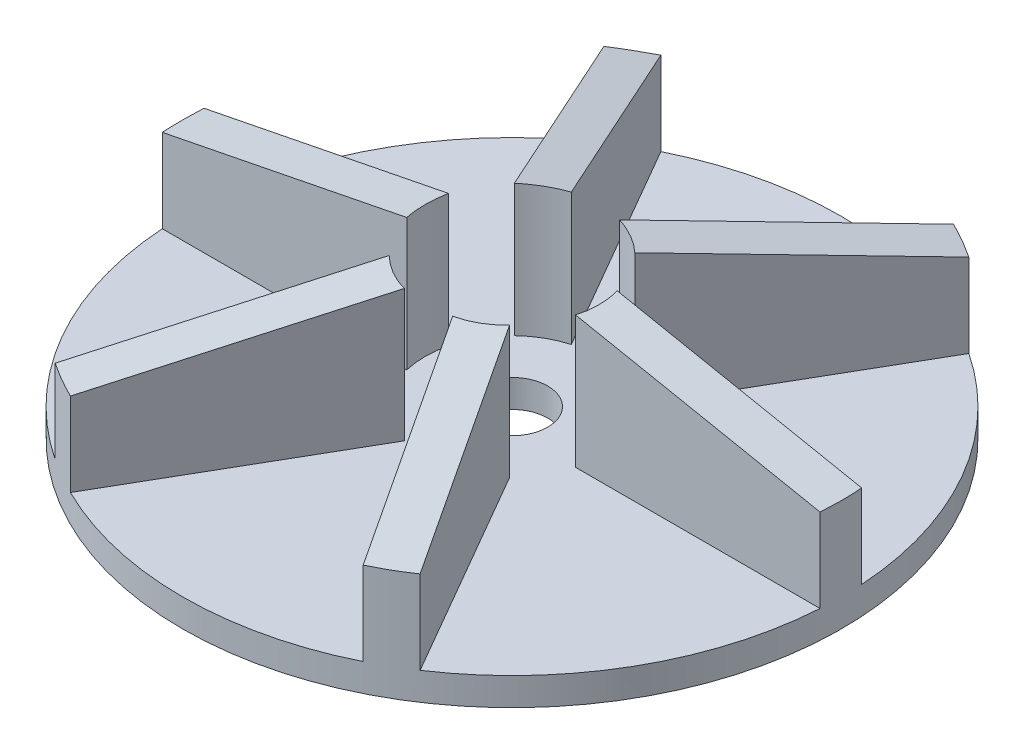
ISO-10303-21;
HEADER;
FILE_DESCRIPTION(('STEP AP214'),'2;1');
FILE_NAME('part.step','',(''),(''),'','','');
FILE_SCHEMA(('AUTOMOTIVE_DESIGN { 1 0 10303 214 1 1 1 1 }'));
ENDSEC;
DATA;
#1=APPLICATION_CONTEXT('core data for automotive mechanical design processes');
#2=APPLICATION_PROTOCOL_DEFINITION('international standard','automotive_design',2000,#1);
#3=PRODUCT_CONTEXT('',#1,'mechanical');
#4=PRODUCT('Part','Part','',(#3));
#5=PRODUCT_RELATED_PRODUCT_CATEGORY('part','',(#4));
#6=PRODUCT_DEFINITION_FORMATION('','',#4);
#7=PRODUCT_DEFINITION_CONTEXT('part definition',#1,'design');
#8=PRODUCT_DEFINITION('design','',#6,#7);
#9=PRODUCT_DEFINITION_SHAPE('','',#8);
#10=(LENGTH_UNIT() NAMED_UNIT(*) SI_UNIT(.MILLI.,.METRE.));
#11=(NAMED_UNIT(*) PLANE_ANGLE_UNIT() SI_UNIT($,.RADIAN.));
#12=(NAMED_UNIT(*) SI_UNIT($,.STERADIAN.) SOLID_ANGLE_UNIT());
#13=UNCERTAINTY_MEASURE_WITH_UNIT(LENGTH_MEASURE(1.E-05),#10,'distance_accuracy_value','');
#14=(GEOMETRIC_REPRESENTATION_CONTEXT(3) GLOBAL_UNCERTAINTY_ASSIGNED_CONTEXT((#13)) GLOBAL_UNIT_ASSIGNED_CONTEXT((#10,
#11,#12)) REPRESENTATION_CONTEXT('',''));
#15=CARTESIAN_POINT('',(0.,0.,0.));
#16=DIRECTION('',(0.,0.,1.));
#17=DIRECTION('',(1.,0.,0.));
#18=AXIS2_PLACEMENT_3D('',#15,#16,#17);
#19=CARTESIAN_POINT('',(0.,12.33424,0.));
#20=DIRECTION('',(0.,-1.,0.));
#21=DIRECTION('',(0.,0.,-1.));
#22=AXIS2_PLACEMENT_3D('',#19,#20,#21);
#23=CYLINDRICAL_SURFACE('',#22,7.9375);
#24=DIRECTION('',(0.,-1.,0.));
#25=VECTOR('',#24,1.);
#26=CARTESIAN_POINT('',(-2.20297650488551,12.33424,7.62566723434235));
#27=LINE('',#26,#25);
#28=CARTESIAN_POINT('',(-2.20297650488551,0.,7.62566723434235));
#29=VERTEX_POINT('',#28);
#30=CARTESIAN_POINT('',(-2.20297650488551,12.0653114927375,7.62566723434235));
#31=VERTEX_POINT('',#30);
#32=EDGE_CURVE('E309',#29,#31,#27,.F.);
#33=ORIENTED_EDGE('',*,*,#32,.F.);
#34=CARTESIAN_POINT('',(0.,0.,0.));
#35=DIRECTION('',(0.,1.,0.));
#36=DIRECTION('',(0.,0.,1.));
#37=AXIS2_PLACEMENT_3D('',#34,#35,#36);
#38=CIRCLE('',#37,7.9375);
#39=CARTESIAN_POINT('',(-5.50253329330423,0.,5.72066723434238));
#40=VERTEX_POINT('',#39);
#41=EDGE_CURVE('E12',#29,#40,#38,.F.);
#42=ORIENTED_EDGE('',*,*,#41,.T.);
#43=DIRECTION('',(0.,-1.,0.));
#44=VECTOR('',#43,1.);
#45=CARTESIAN_POINT('',(-5.50253329330423,12.33424,5.72066723434238));
#46=LINE('',#45,#44);
#47=CARTESIAN_POINT('',(-5.50253329330424,12.0653114927375,5.72066723434239));
#48=VERTEX_POINT('',#47);
#49=EDGE_CURVE('E316',#40,#48,#46,.F.);
#50=ORIENTED_EDGE('',*,*,#49,.T.);
#51=CARTESIAN_POINT('',(0.,13.5940582789952,0.));
#52=DIRECTION('',(-0.0973018132737315,0.980881964629065,0.168531684258686));
#53=DIRECTION('',(-0.490440982314525,-0.194603626547466,0.849468699482764));
#54=AXIS2_PLACEMENT_3D('',#51,#52,#53);
#55=ELLIPSE('',#54,8.09220710159727,7.9375);
#56=EDGE_CURVE('E313',#48,#31,#55,.T.);
#57=ORIENTED_EDGE('',*,*,#56,.T.);
#58=EDGE_LOOP('',(#33,#42,#50,#57));
#59=FACE_BOUND('',#58,.T.);
#60=ADVANCED_FACE('F46',(#59),#23,.F.);
#61=DIRECTION('',(0.,-1.,0.));
#62=VECTOR('',#61,1.);
#63=CARTESIAN_POINT('',(-7.70550979818986,12.33424,1.905));
#64=LINE('',#63,#62);
#65=CARTESIAN_POINT('',(-7.70550979818986,0.,1.905));
#66=VERTEX_POINT('',#65);
#67=CARTESIAN_POINT('',(-7.70550979818987,12.0653114927375,1.905));
#68=VERTEX_POINT('',#67);
#69=EDGE_CURVE('E325',#66,#68,#64,.F.);
#70=ORIENTED_EDGE('',*,*,#69,.F.);
#71=CARTESIAN_POINT('',(-7.70550979818986,0.,-1.905));
#72=VERTEX_POINT('',#71);
#73=EDGE_CURVE('E55',#66,#72,#38,.F.);
#74=ORIENTED_EDGE('',*,*,#73,.T.);
#75=DIRECTION('',(0.,-1.,0.));
#76=VECTOR('',#75,1.);
#77=CARTESIAN_POINT('',(-7.70550979818986,12.33424,-1.905));
#78=LINE('',#77,#76);
#79=CARTESIAN_POINT('',(-7.70550979818989,12.0653114927375,-1.905));
#80=VERTEX_POINT('',#79);
#81=EDGE_CURVE('E336',#72,#80,#78,.F.);
#82=ORIENTED_EDGE('',*,*,#81,.T.);
#83=CARTESIAN_POINT('',(0.,13.5940582789952,0.));
#84=DIRECTION('',(-0.194603626547466,0.980881964629065,0.));
#85=DIRECTION('',(-0.980881964629065,-0.194603626547466,0.));
#86=AXIS2_PLACEMENT_3D('',#83,#84,#85);
#87=ELLIPSE('',#86,8.09220710159727,7.9375);
#88=EDGE_CURVE('E329',#80,#68,#87,.T.);
#89=ORIENTED_EDGE('',*,*,#88,.T.);
#90=EDGE_LOOP('',(#70,#74,#82,#89));
#91=FACE_BOUND('',#90,.T.);
#92=ADVANCED_FACE('F492',(#91),#23,.F.);
#93=DIRECTION('',(0.,-1.,0.));
#94=VECTOR('',#93,1.);
#95=CARTESIAN_POINT('',(-5.50253329330432,12.33424,-5.7206672343423));
#96=LINE('',#95,#94);
#97=CARTESIAN_POINT('',(-5.50253329330432,0.,-5.7206672343423));
#98=VERTEX_POINT('',#97);
#99=CARTESIAN_POINT('',(-5.50253329330432,12.0653114927375,-5.7206672343423));
#100=VERTEX_POINT('',#99);
#101=EDGE_CURVE('E345',#98,#100,#96,.F.);
#102=ORIENTED_EDGE('',*,*,#101,.F.);
#103=CARTESIAN_POINT('',(-2.20297650488561,0.,-7.62566723434232));
#104=VERTEX_POINT('',#103);
#105=EDGE_CURVE('E477',#98,#104,#38,.F.);
#106=ORIENTED_EDGE('',*,*,#105,.T.);
#107=DIRECTION('',(0.,-1.,0.));
#108=VECTOR('',#107,1.);
#109=CARTESIAN_POINT('',(-2.20297650488561,12.33424,-7.62566723434232));
#110=LINE('',#109,#108);
#111=CARTESIAN_POINT('',(-2.20297650488561,12.0653114927375,-7.62566723434232));
#112=VERTEX_POINT('',#111);
#113=EDGE_CURVE('E222',#104,#112,#110,.F.);
#114=ORIENTED_EDGE('',*,*,#113,.T.);
#115=CARTESIAN_POINT('',(0.,13.5940582789952,0.));
#116=DIRECTION('',(-0.0973018132737338,0.980881964629065,-0.168531684258685));
#117=DIRECTION('',(-0.490440982314536,-0.194603626547466,-0.849468699482757));
#118=AXIS2_PLACEMENT_3D('',#115,#116,#117);
#119=ELLIPSE('',#118,8.09220710159727,7.9375);
#120=EDGE_CURVE('E349',#112,#100,#119,.T.);
#121=ORIENTED_EDGE('',*,*,#120,.T.);
#122=EDGE_LOOP('',(#102,#106,#114,#121));
#123=FACE_BOUND('',#122,.T.);
#124=ADVANCED_FACE('F602',(#123),#23,.F.);
#125=DIRECTION('',(0.,-1.,0.));
#126=VECTOR('',#125,1.);
#127=CARTESIAN_POINT('',(2.20297650488556,12.33424,-7.62566723434233));
#128=LINE('',#127,#126);
#129=CARTESIAN_POINT('',(2.20297650488556,0.,-7.62566723434233));
#130=VERTEX_POINT('',#129);
#131=CARTESIAN_POINT('',(2.20297650488556,12.0653114927375,-7.62566723434233));
#132=VERTEX_POINT('',#131);
#133=EDGE_CURVE('E352',#130,#132,#128,.F.);
#134=ORIENTED_EDGE('',*,*,#133,.F.);
#135=CARTESIAN_POINT('',(5.50253329330427,0.,-5.72066723434234));
#136=VERTEX_POINT('',#135);
#137=EDGE_CURVE('E474',#130,#136,#38,.F.);
#138=ORIENTED_EDGE('',*,*,#137,.T.);
#139=DIRECTION('',(0.,-1.,0.));
#140=VECTOR('',#139,1.);
#141=CARTESIAN_POINT('',(5.50253329330427,12.33424,-5.72066723434234));
#142=LINE('',#141,#140);
#143=CARTESIAN_POINT('',(5.50253329330427,12.0653114927375,-5.72066723434234));
#144=VERTEX_POINT('',#143);
#145=EDGE_CURVE('E339',#136,#144,#142,.F.);
#146=ORIENTED_EDGE('',*,*,#145,.T.);
#147=CARTESIAN_POINT('',(0.,13.5940582789952,0.));
#148=DIRECTION('',(0.0973018132737327,0.980881964629065,-0.168531684258686));
#149=DIRECTION('',(0.490440982314531,-0.194603626547466,-0.849468699482761));
#150=AXIS2_PLACEMENT_3D('',#147,#148,#149);
#151=ELLIPSE('',#150,8.09220710159727,7.9375);
#152=EDGE_CURVE('E342',#144,#132,#151,.T.);
#153=ORIENTED_EDGE('',*,*,#152,.T.);
#154=EDGE_LOOP('',(#134,#138,#146,#153));
#155=FACE_BOUND('',#154,.T.);
#156=ADVANCED_FACE('F618',(#155),#23,.F.);
#157=DIRECTION('',(0.,-1.,0.));
#158=VECTOR('',#157,1.);
#159=CARTESIAN_POINT('',(7.70550979818986,12.33424,-1.905));
#160=LINE('',#159,#158);
#161=CARTESIAN_POINT('',(7.70550979818986,0.,-1.905));
#162=VERTEX_POINT('',#161);
#163=CARTESIAN_POINT('',(7.70550979818989,12.0653114927375,-1.905));
#164=VERTEX_POINT('',#163);
#165=EDGE_CURVE('E332',#162,#164,#160,.F.);
#166=ORIENTED_EDGE('',*,*,#165,.F.);
#167=CARTESIAN_POINT('',(7.70550979818986,0.,1.905));
#168=VERTEX_POINT('',#167);
#169=EDGE_CURVE('E56',#162,#168,#38,.F.);
#170=ORIENTED_EDGE('',*,*,#169,.T.);
#171=DIRECTION('',(0.,-1.,0.));
#172=VECTOR('',#171,1.);
#173=CARTESIAN_POINT('',(7.70550979818986,12.33424,1.905));
#174=LINE('',#173,#172);
#175=CARTESIAN_POINT('',(7.70550979818987,12.0653114927375,1.905));
#176=VERTEX_POINT('',#175);
#177=EDGE_CURVE('E319',#168,#176,#174,.F.);
#178=ORIENTED_EDGE('',*,*,#177,.T.);
#179=CARTESIAN_POINT('',(0.,13.5940582789952,0.));
#180=DIRECTION('',(0.194603626547466,0.980881964629065,0.));
#181=DIRECTION('',(0.980881964629065,-0.194603626547466,0.));
#182=AXIS2_PLACEMENT_3D('',#179,#180,#181);
#183=ELLIPSE('',#182,8.09220710159727,7.9375);
#184=EDGE_CURVE('E322',#176,#164,#183,.T.);
#185=ORIENTED_EDGE('',*,*,#184,.T.);
#186=EDGE_LOOP('',(#166,#170,#178,#185));
#187=FACE_BOUND('',#186,.T.);
#188=ADVANCED_FACE('F608',(#187),#23,.F.);
#189=CARTESIAN_POINT('',(30.1117,7.62,-1.905));
#190=DIRECTION('',(0.194603626547466,0.980881964629065,0.));
#191=DIRECTION('',(-0.980881964629065,0.194603626547466,0.));
#192=AXIS2_PLACEMENT_3D('',#189,#190,#191);
#193=PLANE('',#192);
#194=ORIENTED_EDGE('',*,*,#184,.F.);
#195=DIRECTION('',(-0.980881964629065,0.194603626547466,0.));
#196=VECTOR('',#195,1.);
#197=CARTESIAN_POINT('',(30.1117,7.62,1.905));
#198=LINE('',#197,#196);
#199=CARTESIAN_POINT('',(30.0513801994185,7.63196724210362,1.905));
#200=VERTEX_POINT('',#199);
#201=EDGE_CURVE('E434',#200,#176,#198,.T.);
#202=ORIENTED_EDGE('',*,*,#201,.F.);
#203=CARTESIAN_POINT('',(0.,13.5940582789952,0.));
#204=DIRECTION('',(0.194603626547466,0.980881964629065,0.));
#205=DIRECTION('',(0.980881964629065,-0.194603626547466,0.));
#206=AXIS2_PLACEMENT_3D('',#203,#204,#205);
#207=ELLIPSE('',#206,30.6985968606194,30.1117);
#208=CARTESIAN_POINT('',(30.0513801994185,7.63196724210361,-1.905));
#209=VERTEX_POINT('',#208);
#210=EDGE_CURVE('E63',#200,#209,#207,.T.);
#211=ORIENTED_EDGE('',*,*,#210,.T.);
#212=DIRECTION('',(-0.980881964629065,0.194603626547466,0.));
#213=VECTOR('',#212,1.);
#214=CARTESIAN_POINT('',(30.1117,7.62,-1.905));
#215=LINE('',#214,#213);
#216=EDGE_CURVE('E442',#209,#164,#215,.T.);
#217=ORIENTED_EDGE('',*,*,#216,.T.);
#218=EDGE_LOOP('',(#194,#202,#211,#217));
#219=FACE_BOUND('',#218,.T.);
#220=ADVANCED_FACE('F617',(#219),#193,.T.);
#221=CARTESIAN_POINT('',(0.,0.,-1.905));
#222=DIRECTION('',(0.,0.,1.));
#223=DIRECTION('',(1.,0.,0.));
#224=AXIS2_PLACEMENT_3D('',#221,#222,#223);
#225=PLANE('',#224);
#226=DIRECTION('',(1.,0.,0.));
#227=VECTOR('',#226,1.);
#228=CARTESIAN_POINT('',(6.35,0.,-1.905));
#229=LINE('',#228,#227);
#230=CARTESIAN_POINT('',(30.0513801994185,0.,-1.905));
#231=VERTEX_POINT('',#230);
#232=EDGE_CURVE('E438',#162,#231,#229,.T.);
#233=ORIENTED_EDGE('',*,*,#232,.F.);
#234=ORIENTED_EDGE('',*,*,#165,.T.);
#235=ORIENTED_EDGE('',*,*,#216,.F.);
#236=DIRECTION('',(0.,-1.,0.));
#237=VECTOR('',#236,1.);
#238=CARTESIAN_POINT('',(30.0513801994185,12.33424,-1.905));
#239=LINE('',#238,#237);
#240=EDGE_CURVE('E301',#231,#209,#239,.F.);
#241=ORIENTED_EDGE('',*,*,#240,.F.);
#242=EDGE_LOOP('',(#233,#234,#235,#241));
#243=FACE_BOUND('',#242,.T.);
#244=ADVANCED_FACE('F623',(#243),#225,.F.);
#245=CARTESIAN_POINT('',(0.,0.,1.905));
#246=DIRECTION('',(0.,0.,1.));
#247=DIRECTION('',(1.,0.,0.));
#248=AXIS2_PLACEMENT_3D('',#245,#246,#247);
#249=PLANE('',#248);
#250=ORIENTED_EDGE('',*,*,#177,.F.);
#251=DIRECTION('',(1.,0.,0.));
#252=VECTOR('',#251,1.);
#253=CARTESIAN_POINT('',(6.35,0.,1.905));
#254=LINE('',#253,#252);
#255=CARTESIAN_POINT('',(30.0513801994185,0.,1.905));
#256=VERTEX_POINT('',#255);
#257=EDGE_CURVE('E430',#168,#256,#254,.T.);
#258=ORIENTED_EDGE('',*,*,#257,.T.);
#259=DIRECTION('',(0.,-1.,0.));
#260=VECTOR('',#259,1.);
#261=CARTESIAN_POINT('',(30.0513801994185,12.33424,1.905));
#262=LINE('',#261,#260);
#263=EDGE_CURVE('E296',#256,#200,#262,.F.);
#264=ORIENTED_EDGE('',*,*,#263,.T.);
#265=ORIENTED_EDGE('',*,*,#201,.T.);
#266=EDGE_LOOP('',(#250,#258,#264,#265));
#267=FACE_BOUND('',#266,.T.);
#268=ADVANCED_FACE('F467',(#267),#249,.T.);
#269=CARTESIAN_POINT('',(13.4060716057906,7.62,-27.0299971511359));
#270=DIRECTION('',(0.0973018132737327,0.980881964629065,-0.168531684258686));
#271=DIRECTION('',(0.,0.169335193182353,0.985558517973385));
#272=AXIS2_PLACEMENT_3D('',#269,#270,#271);
#273=PLANE('',#272);
#274=ORIENTED_EDGE('',*,*,#152,.F.);
#275=DIRECTION('',(-0.490440982314531,0.194603626547466,0.849468699482761));
#276=VECTOR('',#275,1.);
#277=CARTESIAN_POINT('',(16.7056283942093,7.62,-25.1249971511359));
#278=LINE('',#277,#276);
#279=CARTESIAN_POINT('',(16.6754684939185,7.63196724210362,-25.0727586714811));
#280=VERTEX_POINT('',#279);
#281=EDGE_CURVE('E418',#280,#144,#278,.T.);
#282=ORIENTED_EDGE('',*,*,#281,.F.);
#283=CARTESIAN_POINT('',(0.,13.5940582789952,0.));
#284=DIRECTION('',(0.0973018132737327,0.980881964629065,-0.168531684258686));
#285=DIRECTION('',(0.490440982314531,-0.194603626547466,-0.849468699482761));
#286=AXIS2_PLACEMENT_3D('',#283,#284,#285);
#287=ELLIPSE('',#286,30.6985968606194,30.1117);
#288=CARTESIAN_POINT('',(13.3759117054998,7.63196724210362,-26.9777586714811));
#289=VERTEX_POINT('',#288);
#290=EDGE_CURVE('E70',#280,#289,#287,.T.);
#291=ORIENTED_EDGE('',*,*,#290,.T.);
#292=DIRECTION('',(-0.490440982314531,0.194603626547466,0.849468699482761));
#293=VECTOR('',#292,1.);
#294=CARTESIAN_POINT('',(13.4060716057906,7.62,-27.0299971511359));
#295=LINE('',#294,#293);
#296=EDGE_CURVE('E426',#289,#132,#295,.T.);
#297=ORIENTED_EDGE('',*,*,#296,.T.);
#298=EDGE_LOOP('',(#274,#282,#291,#297));
#299=FACE_BOUND('',#298,.T.);
#300=ADVANCED_FACE('F639',(#299),#273,.T.);
#301=CARTESIAN_POINT('',(-1.64977839420936,0.,-0.952499999999996));
#302=DIRECTION('',(0.86602540378444,0.,0.499999999999998));
#303=DIRECTION('',(0.499999999999998,0.,-0.86602540378444));
#304=AXIS2_PLACEMENT_3D('',#301,#302,#303);
#305=PLANE('',#304);
#306=DIRECTION('',(0.499999999999998,0.,-0.86602540378444));
#307=VECTOR('',#306,1.);
#308=CARTESIAN_POINT('',(1.52522160579063,0.,-6.45176131403119));
#309=LINE('',#308,#307);
#310=CARTESIAN_POINT('',(13.3759117054998,0.,-26.9777586714811));
#311=VERTEX_POINT('',#310);
#312=EDGE_CURVE('E422',#130,#311,#309,.T.);
#313=ORIENTED_EDGE('',*,*,#312,.F.);
#314=ORIENTED_EDGE('',*,*,#133,.T.);
#315=ORIENTED_EDGE('',*,*,#296,.F.);
#316=DIRECTION('',(0.,-1.,0.));
#317=VECTOR('',#316,1.);
#318=CARTESIAN_POINT('',(13.3759117054998,12.33424,-26.9777586714811));
#319=LINE('',#318,#317);
#320=EDGE_CURVE('E293',#311,#289,#319,.F.);
#321=ORIENTED_EDGE('',*,*,#320,.F.);
#322=EDGE_LOOP('',(#313,#314,#315,#321));
#323=FACE_BOUND('',#322,.T.);
#324=ADVANCED_FACE('F643',(#323),#305,.F.);
#325=CARTESIAN_POINT('',(1.64977839420936,0.,0.952499999999996));
#326=DIRECTION('',(0.86602540378444,0.,0.499999999999998));
#327=DIRECTION('',(0.499999999999998,0.,-0.86602540378444));
#328=AXIS2_PLACEMENT_3D('',#325,#326,#327);
#329=PLANE('',#328);
#330=ORIENTED_EDGE('',*,*,#145,.F.);
#331=DIRECTION('',(0.499999999999998,0.,-0.86602540378444));
#332=VECTOR('',#331,1.);
#333=CARTESIAN_POINT('',(4.82477839420935,0.,-4.5467613140312));
#334=LINE('',#333,#332);
#335=CARTESIAN_POINT('',(16.6754684939185,0.,-25.0727586714811));
#336=VERTEX_POINT('',#335);
#337=EDGE_CURVE('E414',#136,#336,#334,.T.);
#338=ORIENTED_EDGE('',*,*,#337,.T.);
#339=DIRECTION('',(0.,-1.,0.));
#340=VECTOR('',#339,1.);
#341=CARTESIAN_POINT('',(16.6754684939185,12.33424,-25.0727586714811));
#342=LINE('',#341,#340);
#343=EDGE_CURVE('E288',#336,#280,#342,.F.);
#344=ORIENTED_EDGE('',*,*,#343,.T.);
#345=ORIENTED_EDGE('',*,*,#281,.T.);
#346=EDGE_LOOP('',(#330,#338,#344,#345));
#347=FACE_BOUND('',#346,.T.);
#348=ADVANCED_FACE('F635',(#347),#329,.T.);
#349=CARTESIAN_POINT('',(-16.7056283942095,7.62,-25.1249971511358));
#350=DIRECTION('',(-0.0973018132737338,0.980881964629065,-0.168531684258685));
#351=DIRECTION('',(0.,0.169335193182352,0.985558517973385));
#352=AXIS2_PLACEMENT_3D('',#349,#350,#351);
#353=PLANE('',#352);
#354=ORIENTED_EDGE('',*,*,#120,.F.);
#355=DIRECTION('',(0.490440982314537,0.194603626547466,0.849468699482757));
#356=VECTOR('',#355,1.);
#357=CARTESIAN_POINT('',(-13.4060716057908,7.62,-27.0299971511358));
#358=LINE('',#357,#356);
#359=CARTESIAN_POINT('',(-13.3759117055,7.63196724210362,-26.977758671481));
#360=VERTEX_POINT('',#359);
#361=EDGE_CURVE('E402',#360,#112,#358,.T.);
#362=ORIENTED_EDGE('',*,*,#361,.F.);
#363=CARTESIAN_POINT('',(0.,13.5940582789952,0.));
#364=DIRECTION('',(-0.0973018132737338,0.980881964629065,-0.168531684258685));
#365=DIRECTION('',(-0.490440982314536,-0.194603626547466,-0.849468699482757));
#366=AXIS2_PLACEMENT_3D('',#363,#364,#365);
#367=ELLIPSE('',#366,30.6985968606194,30.1117);
#368=CARTESIAN_POINT('',(-16.6754684939187,7.63196724210362,-25.072758671481));
#369=VERTEX_POINT('',#368);
#370=EDGE_CURVE('E281',#360,#369,#367,.T.);
#371=ORIENTED_EDGE('',*,*,#370,.T.);
#372=DIRECTION('',(0.490440982314537,0.194603626547466,0.849468699482757));
#373=VECTOR('',#372,1.);
#374=CARTESIAN_POINT('',(-16.7056283942095,7.62,-25.1249971511358));
#375=LINE('',#374,#373);
#376=EDGE_CURVE('E410',#369,#100,#375,.T.);
#377=ORIENTED_EDGE('',*,*,#376,.T.);
#378=EDGE_LOOP('',(#354,#362,#371,#377));
#379=FACE_BOUND('',#378,.T.);
#380=ADVANCED_FACE('F651',(#379),#353,.T.);
#381=CARTESIAN_POINT('',(-1.64977839420935,0.,0.952500000000008));
#382=DIRECTION('',(0.866025403784436,0.,-0.500000000000004));
#383=DIRECTION('',(-0.500000000000004,0.,-0.866025403784436));
#384=AXIS2_PLACEMENT_3D('',#381,#382,#383);
#385=PLANE('',#384);
#386=DIRECTION('',(-0.500000000000004,0.,-0.866025403784436));
#387=VECTOR('',#386,1.);
#388=CARTESIAN_POINT('',(-4.82477839420938,0.,-4.54676131403116));
#389=LINE('',#388,#387);
#390=CARTESIAN_POINT('',(-16.6754684939187,0.,-25.072758671481));
#391=VERTEX_POINT('',#390);
#392=EDGE_CURVE('E406',#98,#391,#389,.T.);
#393=ORIENTED_EDGE('',*,*,#392,.F.);
#394=ORIENTED_EDGE('',*,*,#101,.T.);
#395=ORIENTED_EDGE('',*,*,#376,.F.);
#396=DIRECTION('',(0.,-1.,0.));
#397=VECTOR('',#396,1.);
#398=CARTESIAN_POINT('',(-16.6754684939187,12.33424,-25.072758671481));
#399=LINE('',#398,#397);
#400=EDGE_CURVE('E285',#391,#369,#399,.F.);
#401=ORIENTED_EDGE('',*,*,#400,.F.);
#402=EDGE_LOOP('',(#393,#394,#395,#401));
#403=FACE_BOUND('',#402,.T.);
#404=ADVANCED_FACE('F654',(#403),#385,.F.);
#405=CARTESIAN_POINT('',(1.64977839420935,0.,-0.952500000000007));
#406=DIRECTION('',(0.866025403784436,0.,-0.500000000000004));
#407=DIRECTION('',(-0.500000000000004,0.,-0.866025403784436));
#408=AXIS2_PLACEMENT_3D('',#405,#406,#407);
#409=PLANE('',#408);
#410=ORIENTED_EDGE('',*,*,#113,.F.);
#411=DIRECTION('',(-0.500000000000004,0.,-0.866025403784436));
#412=VECTOR('',#411,1.);
#413=CARTESIAN_POINT('',(-1.52522160579068,0.,-6.45176131403118));
#414=LINE('',#413,#412);
#415=CARTESIAN_POINT('',(-13.3759117055,0.,-26.977758671481));
#416=VERTEX_POINT('',#415);
#417=EDGE_CURVE('E398',#104,#416,#414,.T.);
#418=ORIENTED_EDGE('',*,*,#417,.T.);
#419=DIRECTION('',(0.,-1.,0.));
#420=VECTOR('',#419,1.);
#421=CARTESIAN_POINT('',(-13.3759117055,12.33424,-26.977758671481));
#422=LINE('',#421,#420);
#423=EDGE_CURVE('E277',#416,#360,#422,.F.);
#424=ORIENTED_EDGE('',*,*,#423,.T.);
#425=ORIENTED_EDGE('',*,*,#361,.T.);
#426=EDGE_LOOP('',(#410,#418,#424,#425));
#427=FACE_BOUND('',#426,.T.);
#428=ADVANCED_FACE('F648',(#427),#409,.T.);
#429=CARTESIAN_POINT('',(-30.1117,7.62,1.905));
#430=DIRECTION('',(-0.194603626547466,0.980881964629065,0.));
#431=DIRECTION('',(-0.980881964629065,-0.194603626547466,0.));
#432=AXIS2_PLACEMENT_3D('',#429,#430,#431);
#433=PLANE('',#432);
#434=ORIENTED_EDGE('',*,*,#88,.F.);
#435=DIRECTION('',(0.980881964629065,0.194603626547466,0.));
#436=VECTOR('',#435,1.);
#437=CARTESIAN_POINT('',(-30.1117,7.62,-1.905));
#438=LINE('',#437,#436);
#439=CARTESIAN_POINT('',(-30.0513801994185,7.63196724210362,-1.905));
#440=VERTEX_POINT('',#439);
#441=EDGE_CURVE('E386',#440,#80,#438,.T.);
#442=ORIENTED_EDGE('',*,*,#441,.F.);
#443=CARTESIAN_POINT('',(0.,13.5940582789952,0.));
#444=DIRECTION('',(-0.194603626547466,0.980881964629065,0.));
#445=DIRECTION('',(-0.980881964629065,-0.194603626547466,0.));
#446=AXIS2_PLACEMENT_3D('',#443,#444,#445);
#447=ELLIPSE('',#446,30.6985968606194,30.1117);
#448=CARTESIAN_POINT('',(-30.0513801994185,7.63196724210361,1.905));
#449=VERTEX_POINT('',#448);
#450=EDGE_CURVE('E270',#440,#449,#447,.T.);
#451=ORIENTED_EDGE('',*,*,#450,.T.);
#452=DIRECTION('',(0.980881964629065,0.194603626547466,0.));
#453=VECTOR('',#452,1.);
#454=CARTESIAN_POINT('',(-30.1117,7.62,1.905));
#455=LINE('',#454,#453);
#456=EDGE_CURVE('E394',#449,#68,#455,.T.);
#457=ORIENTED_EDGE('',*,*,#456,.T.);
#458=EDGE_LOOP('',(#434,#442,#451,#457));
#459=FACE_BOUND('',#458,.T.);
#460=ADVANCED_FACE('F661',(#459),#433,.T.);
#461=CARTESIAN_POINT('',(0.,0.,1.905));
#462=DIRECTION('',(0.,0.,-1.));
#463=DIRECTION('',(-1.,0.,0.));
#464=AXIS2_PLACEMENT_3D('',#461,#462,#463);
#465=PLANE('',#464);
#466=DIRECTION('',(-1.,0.,0.));
#467=VECTOR('',#466,1.);
#468=CARTESIAN_POINT('',(-6.35,0.,1.905));
#469=LINE('',#468,#467);
#470=CARTESIAN_POINT('',(-30.0513801994185,0.,1.905));
#471=VERTEX_POINT('',#470);
#472=EDGE_CURVE('E390',#66,#471,#469,.T.);
#473=ORIENTED_EDGE('',*,*,#472,.F.);
#474=ORIENTED_EDGE('',*,*,#69,.T.);
#475=ORIENTED_EDGE('',*,*,#456,.F.);
#476=DIRECTION('',(0.,-1.,0.));
#477=VECTOR('',#476,1.);
#478=CARTESIAN_POINT('',(-30.0513801994185,12.33424,1.905));
#479=LINE('',#478,#477);
#480=EDGE_CURVE('E274',#471,#449,#479,.F.);
#481=ORIENTED_EDGE('',*,*,#480,.F.);
#482=EDGE_LOOP('',(#473,#474,#475,#481));
#483=FACE_BOUND('',#482,.T.);
#484=ADVANCED_FACE('F841',(#483),#465,.F.);
#485=CARTESIAN_POINT('',(0.,0.,-1.905));
#486=DIRECTION('',(0.,0.,-1.));
#487=DIRECTION('',(-1.,0.,0.));
#488=AXIS2_PLACEMENT_3D('',#485,#486,#487);
#489=PLANE('',#488);
#490=ORIENTED_EDGE('',*,*,#81,.F.);
#491=DIRECTION('',(-1.,0.,0.));
#492=VECTOR('',#491,1.);
#493=CARTESIAN_POINT('',(-6.35,0.,-1.905));
#494=LINE('',#493,#492);
#495=CARTESIAN_POINT('',(-30.0513801994185,0.,-1.905));
#496=VERTEX_POINT('',#495);
#497=EDGE_CURVE('E382',#72,#496,#494,.T.);
#498=ORIENTED_EDGE('',*,*,#497,.T.);
#499=DIRECTION('',(0.,-1.,0.));
#500=VECTOR('',#499,1.);
#501=CARTESIAN_POINT('',(-30.0513801994185,12.33424,-1.905));
#502=LINE('',#501,#500);
#503=EDGE_CURVE('E266',#496,#440,#502,.F.);
#504=ORIENTED_EDGE('',*,*,#503,.T.);
#505=ORIENTED_EDGE('',*,*,#441,.T.);
#506=EDGE_LOOP('',(#490,#498,#504,#505));
#507=FACE_BOUND('',#506,.T.);
#508=ADVANCED_FACE('F497',(#507),#489,.T.);
#509=CARTESIAN_POINT('',(-13.4060716057904,7.62,27.029997151136));
#510=DIRECTION('',(-0.0973018132737315,0.980881964629065,0.168531684258686));
#511=DIRECTION('',(0.,-0.169335193182354,0.985558517973385));
#512=AXIS2_PLACEMENT_3D('',#509,#510,#511);
#513=PLANE('',#512);
#514=ORIENTED_EDGE('',*,*,#56,.F.);
#515=DIRECTION('',(0.490440982314525,0.194603626547466,-0.849468699482764));
#516=VECTOR('',#515,1.);
#517=CARTESIAN_POINT('',(-16.7056283942091,7.62,25.124997151136));
#518=LINE('',#517,#516);
#519=CARTESIAN_POINT('',(-16.6754684939184,7.63196724210362,25.0727586714812));
#520=VERTEX_POINT('',#519);
#521=EDGE_CURVE('E371',#520,#48,#518,.T.);
#522=ORIENTED_EDGE('',*,*,#521,.F.);
#523=CARTESIAN_POINT('',(0.,13.5940582789952,0.));
#524=DIRECTION('',(-0.0973018132737315,0.980881964629065,0.168531684258686));
#525=DIRECTION('',(-0.490440982314525,-0.194603626547466,0.849468699482764));
#526=AXIS2_PLACEMENT_3D('',#523,#524,#525);
#527=ELLIPSE('',#526,30.6985968606194,30.1117);
#528=CARTESIAN_POINT('',(-13.3759117054996,7.63196724210361,26.9777586714812));
#529=VERTEX_POINT('',#528);
#530=EDGE_CURVE('E259',#520,#529,#527,.T.);
#531=ORIENTED_EDGE('',*,*,#530,.T.);
#532=DIRECTION('',(0.490440982314525,0.194603626547466,-0.849468699482764));
#533=VECTOR('',#532,1.);
#534=CARTESIAN_POINT('',(-13.4060716057904,7.62,27.029997151136));
#535=LINE('',#534,#533);
#536=EDGE_CURVE('E378',#529,#31,#535,.T.);
#537=ORIENTED_EDGE('',*,*,#536,.T.);
#538=EDGE_LOOP('',(#514,#522,#531,#537));
#539=FACE_BOUND('',#538,.T.);
#540=ADVANCED_FACE('F584',(#539),#513,.T.);
#541=CARTESIAN_POINT('',(1.64977839420936,0.,0.952499999999985));
#542=DIRECTION('',(-0.866025403784443,0.,-0.499999999999992));
#543=DIRECTION('',(-0.499999999999992,0.,0.866025403784443));
#544=AXIS2_PLACEMENT_3D('',#541,#542,#543);
#545=PLANE('',#544);
#546=DIRECTION('',(-0.499999999999992,0.,0.866025403784443));
#547=VECTOR('',#546,1.);
#548=CARTESIAN_POINT('',(-1.52522160579059,0.,6.4517613140312));
#549=LINE('',#548,#547);
#550=CARTESIAN_POINT('',(-13.3759117054996,0.,26.9777586714812));
#551=VERTEX_POINT('',#550);
#552=EDGE_CURVE('E375',#29,#551,#549,.T.);
#553=ORIENTED_EDGE('',*,*,#552,.F.);
#554=ORIENTED_EDGE('',*,*,#32,.T.);
#555=ORIENTED_EDGE('',*,*,#536,.F.);
#556=DIRECTION('',(0.,-1.,0.));
#557=VECTOR('',#556,1.);
#558=CARTESIAN_POINT('',(-13.3759117054996,12.33424,26.9777586714812));
#559=LINE('',#558,#557);
#560=EDGE_CURVE('E263',#551,#529,#559,.F.);
#561=ORIENTED_EDGE('',*,*,#560,.F.);
#562=EDGE_LOOP('',(#553,#554,#555,#561));
#563=FACE_BOUND('',#562,.T.);
#564=ADVANCED_FACE('F588',(#563),#545,.F.);
#565=CARTESIAN_POINT('',(-1.64977839420936,0.,-0.952499999999985));
#566=DIRECTION('',(-0.866025403784443,0.,-0.499999999999992));
#567=DIRECTION('',(-0.499999999999992,0.,0.866025403784443));
#568=AXIS2_PLACEMENT_3D('',#565,#566,#567);
#569=PLANE('',#568);
#570=ORIENTED_EDGE('',*,*,#49,.F.);
#571=DIRECTION('',(-0.499999999999992,0.,0.866025403784443));
#572=VECTOR('',#571,1.);
#573=CARTESIAN_POINT('',(-4.82477839420931,0.,4.54676131403123));
#574=LINE('',#573,#572);
#575=CARTESIAN_POINT('',(-16.6754684939184,0.,25.0727586714812));
#576=VERTEX_POINT('',#575);
#577=EDGE_CURVE('E367',#40,#576,#574,.T.);
#578=ORIENTED_EDGE('',*,*,#577,.T.);
#579=DIRECTION('',(0.,-1.,0.));
#580=VECTOR('',#579,1.);
#581=CARTESIAN_POINT('',(-16.6754684939184,12.33424,25.0727586714812));
#582=LINE('',#581,#580);
#583=EDGE_CURVE('E255',#576,#520,#582,.F.);
#584=ORIENTED_EDGE('',*,*,#583,.T.);
#585=ORIENTED_EDGE('',*,*,#521,.T.);
#586=EDGE_LOOP('',(#570,#578,#584,#585));
#587=FACE_BOUND('',#586,.T.);
#588=ADVANCED_FACE('F580',(#587),#569,.T.);
#589=CARTESIAN_POINT('',(16.7056283942096,7.62,25.1249971511357));
#590=DIRECTION('',(0.097301813273735,0.980881964629065,0.168531684258684));
#591=DIRECTION('',(0.,-0.169335193182352,0.985558517973385));
#592=AXIS2_PLACEMENT_3D('',#589,#590,#591);
#593=PLANE('',#592);
#594=CARTESIAN_POINT('',(0.,13.5940582789952,0.));
#595=DIRECTION('',(0.097301813273735,0.980881964629065,0.168531684258684));
#596=DIRECTION('',(0.490440982314542,-0.194603626547466,0.849468699482754));
#597=AXIS2_PLACEMENT_3D('',#594,#595,#596);
#598=ELLIPSE('',#597,8.09220710159727,7.9375);
#599=CARTESIAN_POINT('',(2.20297650488567,12.0653114927375,7.6256672343423));
#600=VERTEX_POINT('',#599);
#601=CARTESIAN_POINT('',(5.50253329330435,12.0653114927375,5.72066723434226));
#602=VERTEX_POINT('',#601);
#603=EDGE_CURVE('E304',#600,#602,#598,.T.);
#604=ORIENTED_EDGE('',*,*,#603,.F.);
#605=DIRECTION('',(-0.490440982314542,0.194603626547466,-0.849468699482754));
#606=VECTOR('',#605,1.);
#607=CARTESIAN_POINT('',(13.406071605791,7.62,27.0299971511357));
#608=LINE('',#607,#606);
#609=CARTESIAN_POINT('',(13.3759117055002,7.63196724210362,26.9777586714809));
#610=VERTEX_POINT('',#609);
#611=EDGE_CURVE('E221',#610,#600,#608,.T.);
#612=ORIENTED_EDGE('',*,*,#611,.F.);
#613=CARTESIAN_POINT('',(0.,13.5940582789952,0.));
#614=DIRECTION('',(0.097301813273735,0.980881964629065,0.168531684258684));
#615=DIRECTION('',(0.490440982314542,-0.194603626547466,0.849468699482754));
#616=AXIS2_PLACEMENT_3D('',#613,#614,#615);
#617=ELLIPSE('',#616,30.6985968606194,30.1117);
#618=CARTESIAN_POINT('',(16.6754684939189,7.63196724210362,25.0727586714809));
#619=VERTEX_POINT('',#618);
#620=EDGE_CURVE('E244',#610,#619,#617,.T.);
#621=ORIENTED_EDGE('',*,*,#620,.T.);
#622=DIRECTION('',(-0.490440982314542,0.194603626547466,-0.849468699482754));
#623=VECTOR('',#622,1.);
#624=CARTESIAN_POINT('',(16.7056283942096,7.62,25.1249971511357));
#625=LINE('',#624,#623);
#626=EDGE_CURVE('E363',#619,#602,#625,.T.);
#627=ORIENTED_EDGE('',*,*,#626,.T.);
#628=EDGE_LOOP('',(#604,#612,#621,#627));
#629=FACE_BOUND('',#628,.T.);
#630=ADVANCED_FACE('F458',(#629),#593,.T.);
#631=CARTESIAN_POINT('',(1.64977839420934,0.,-0.952500000000019));
#632=DIRECTION('',(-0.866025403784433,0.,0.50000000000001));
#633=DIRECTION('',(0.50000000000001,0.,0.866025403784433));
#634=AXIS2_PLACEMENT_3D('',#631,#632,#633);
#635=PLANE('',#634);
#636=DIRECTION('',(0.50000000000001,0.,0.866025403784433));
#637=VECTOR('',#636,1.);
#638=CARTESIAN_POINT('',(4.82477839420941,0.,4.54676131403113));
#639=LINE('',#638,#637);
#640=CARTESIAN_POINT('',(5.50253329330435,0.,5.72066723434226));
#641=VERTEX_POINT('',#640);
#642=CARTESIAN_POINT('',(16.6754684939189,0.,25.0727586714809));
#643=VERTEX_POINT('',#642);
#644=EDGE_CURVE('E360',#641,#643,#639,.T.);
#645=ORIENTED_EDGE('',*,*,#644,.F.);
#646=DIRECTION('',(0.,-1.,0.));
#647=VECTOR('',#646,1.);
#648=CARTESIAN_POINT('',(5.50253329330435,12.33424,5.72066723434226));
#649=LINE('',#648,#647);
#650=EDGE_CURVE('E234',#641,#602,#649,.F.);
#651=ORIENTED_EDGE('',*,*,#650,.T.);
#652=ORIENTED_EDGE('',*,*,#626,.F.);
#653=DIRECTION('',(0.,-1.,0.));
#654=VECTOR('',#653,1.);
#655=CARTESIAN_POINT('',(16.6754684939189,12.33424,25.0727586714809));
#656=LINE('',#655,#654);
#657=EDGE_CURVE('E252',#643,#619,#656,.F.);
#658=ORIENTED_EDGE('',*,*,#657,.F.);
#659=EDGE_LOOP('',(#645,#651,#652,#658));
#660=FACE_BOUND('',#659,.T.);
#661=ADVANCED_FACE('F461',(#660),#635,.F.);
#662=CARTESIAN_POINT('',(-1.64977839420934,0.,0.952500000000019));
#663=DIRECTION('',(-0.866025403784433,0.,0.50000000000001));
#664=DIRECTION('',(0.50000000000001,0.,0.866025403784433));
#665=AXIS2_PLACEMENT_3D('',#662,#663,#664);
#666=PLANE('',#665);
#667=DIRECTION('',(0.,-1.,0.));
#668=VECTOR('',#667,1.);
#669=CARTESIAN_POINT('',(2.20297650488567,12.33424,7.6256672343423));
#670=LINE('',#669,#668);
#671=CARTESIAN_POINT('',(2.20297650488567,0.,7.6256672343423));
#672=VERTEX_POINT('',#671);
#673=EDGE_CURVE('E225',#672,#600,#670,.F.);
#674=ORIENTED_EDGE('',*,*,#673,.F.);
#675=DIRECTION('',(0.50000000000001,0.,0.866025403784433));
#676=VECTOR('',#675,1.);
#677=CARTESIAN_POINT('',(1.52522160579072,0.,6.45176131403117));
#678=LINE('',#677,#676);
#679=CARTESIAN_POINT('',(13.3759117055002,0.,26.9777586714809));
#680=VERTEX_POINT('',#679);
#681=EDGE_CURVE('E208',#672,#680,#678,.T.);
#682=ORIENTED_EDGE('',*,*,#681,.T.);
#683=DIRECTION('',(0.,-1.,0.));
#684=VECTOR('',#683,1.);
#685=CARTESIAN_POINT('',(13.3759117055002,12.33424,26.9777586714809));
#686=LINE('',#685,#684);
#687=EDGE_CURVE('E231',#680,#610,#686,.F.);
#688=ORIENTED_EDGE('',*,*,#687,.T.);
#689=ORIENTED_EDGE('',*,*,#611,.T.);
#690=EDGE_LOOP('',(#674,#682,#688,#689));
#691=FACE_BOUND('',#690,.T.);
#692=ADVANCED_FACE('F226',(#691),#666,.T.);
#693=CARTESIAN_POINT('',(0.,0.,0.));
#694=DIRECTION('',(0.,1.,0.));
#695=DIRECTION('',(0.,0.,1.));
#696=AXIS2_PLACEMENT_3D('',#693,#694,#695);
#697=PLANE('',#696);
#698=ORIENTED_EDGE('',*,*,#681,.F.);
#699=CARTESIAN_POINT('',(0.,0.,0.));
#700=DIRECTION('',(0.,1.,0.));
#701=DIRECTION('',(0.,0.,1.));
#702=AXIS2_PLACEMENT_3D('',#699,#700,#701);
#703=CIRCLE('',#702,7.9375);
#704=EDGE_CURVE('E214',#672,#641,#703,.T.);
#705=ORIENTED_EDGE('',*,*,#704,.T.);
#706=ORIENTED_EDGE('',*,*,#644,.T.);
#707=CARTESIAN_POINT('',(0.,0.,0.));
#708=DIRECTION('',(0.,1.,0.));
#709=DIRECTION('',(0.,0.,1.));
#710=AXIS2_PLACEMENT_3D('',#707,#708,#709);
#711=CIRCLE('',#710,30.1117);
#712=EDGE_CURVE('E446',#643,#256,#711,.T.);
#713=ORIENTED_EDGE('',*,*,#712,.T.);
#714=ORIENTED_EDGE('',*,*,#257,.F.);
#715=ORIENTED_EDGE('',*,*,#169,.F.);
#716=ORIENTED_EDGE('',*,*,#232,.T.);
#717=EDGE_CURVE('E451',#231,#336,#711,.T.);
#718=ORIENTED_EDGE('',*,*,#717,.T.);
#719=ORIENTED_EDGE('',*,*,#337,.F.);
#720=ORIENTED_EDGE('',*,*,#137,.F.);
#721=ORIENTED_EDGE('',*,*,#312,.T.);
#722=EDGE_CURVE('E504',#311,#416,#711,.T.);
#723=ORIENTED_EDGE('',*,*,#722,.T.);
#724=ORIENTED_EDGE('',*,*,#417,.F.);
#725=ORIENTED_EDGE('',*,*,#105,.F.);
#726=ORIENTED_EDGE('',*,*,#392,.T.);
#727=EDGE_CURVE('E501',#391,#496,#711,.T.);
#728=ORIENTED_EDGE('',*,*,#727,.T.);
#729=ORIENTED_EDGE('',*,*,#497,.F.);
#730=ORIENTED_EDGE('',*,*,#73,.F.);
#731=ORIENTED_EDGE('',*,*,#472,.T.);
#732=EDGE_CURVE('E505',#471,#576,#711,.T.);
#733=ORIENTED_EDGE('',*,*,#732,.T.);
#734=ORIENTED_EDGE('',*,*,#577,.F.);
#735=ORIENTED_EDGE('',*,*,#41,.F.);
#736=ORIENTED_EDGE('',*,*,#552,.T.);
#737=EDGE_CURVE('E217',#551,#680,#711,.T.);
#738=ORIENTED_EDGE('',*,*,#737,.T.);
#739=EDGE_LOOP('',(#698,#705,#706,#713,#714,#715,#716,#718,#719,#720,#721,#723,#724,#725,#726,
#728,#729,#730,#731,#733,#734,#735,#736,#738));
#740=FACE_BOUND('',#739,.T.);
#741=CARTESIAN_POINT('',(0.,0.,0.));
#742=DIRECTION('',(0.,1.,0.));
#743=DIRECTION('',(0.,0.,1.));
#744=AXIS2_PLACEMENT_3D('',#741,#742,#743);
#745=CIRCLE('',#744,3.2639);
#746=CARTESIAN_POINT('',(0.,0.,3.2639));
#747=VERTEX_POINT('',#746);
#748=EDGE_CURVE('E237',#747,#747,#745,.F.);
#749=ORIENTED_EDGE('',*,*,#748,.T.);
#750=EDGE_LOOP('',(#749));
#751=FACE_BOUND('',#750,.T.);
#752=ADVANCED_FACE('F210',(#740,#751),#697,.T.);
#753=CARTESIAN_POINT('',(0.,-2.54,0.));
#754=DIRECTION('',(0.,1.,0.));
#755=DIRECTION('',(0.,0.,1.));
#756=AXIS2_PLACEMENT_3D('',#753,#754,#755);
#757=CYLINDRICAL_SURFACE('',#756,30.1117);
#758=CARTESIAN_POINT('',(0.,-2.54,0.));
#759=DIRECTION('',(0.,1.,0.));
#760=DIRECTION('',(0.,0.,1.));
#761=AXIS2_PLACEMENT_3D('',#758,#759,#760);
#762=CIRCLE('',#761,30.1117);
#763=CARTESIAN_POINT('',(0.,-2.54,30.1117));
#764=VERTEX_POINT('',#763);
#765=EDGE_CURVE('E447',#764,#764,#762,.T.);
#766=ORIENTED_EDGE('',*,*,#765,.T.);
#767=EDGE_LOOP('',(#766));
#768=FACE_BOUND('',#767,.T.);
#769=ORIENTED_EDGE('',*,*,#263,.F.);
#770=ORIENTED_EDGE('',*,*,#712,.F.);
#771=ORIENTED_EDGE('',*,*,#657,.T.);
#772=ORIENTED_EDGE('',*,*,#620,.F.);
#773=ORIENTED_EDGE('',*,*,#687,.F.);
#774=ORIENTED_EDGE('',*,*,#737,.F.);
#775=ORIENTED_EDGE('',*,*,#560,.T.);
#776=ORIENTED_EDGE('',*,*,#530,.F.);
#777=ORIENTED_EDGE('',*,*,#583,.F.);
#778=ORIENTED_EDGE('',*,*,#732,.F.);
#779=ORIENTED_EDGE('',*,*,#480,.T.);
#780=ORIENTED_EDGE('',*,*,#450,.F.);
#781=ORIENTED_EDGE('',*,*,#503,.F.);
#782=ORIENTED_EDGE('',*,*,#727,.F.);
#783=ORIENTED_EDGE('',*,*,#400,.T.);
#784=ORIENTED_EDGE('',*,*,#370,.F.);
#785=ORIENTED_EDGE('',*,*,#423,.F.);
#786=ORIENTED_EDGE('',*,*,#722,.F.);
#787=ORIENTED_EDGE('',*,*,#320,.T.);
#788=ORIENTED_EDGE('',*,*,#290,.F.);
#789=ORIENTED_EDGE('',*,*,#343,.F.);
#790=ORIENTED_EDGE('',*,*,#717,.F.);
#791=ORIENTED_EDGE('',*,*,#240,.T.);
#792=ORIENTED_EDGE('',*,*,#210,.F.);
#793=EDGE_LOOP('',(#769,#770,#771,#772,#773,#774,#775,#776,#777,#778,#779,#780,#781,#782,#783,
#784,#785,#786,#787,#788,#789,#790,#791,#792));
#794=FACE_BOUND('',#793,.T.);
#795=ADVANCED_FACE('F48',(#768,#794),#757,.T.);
#796=CARTESIAN_POINT('',(0.,-2.54,0.));
#797=DIRECTION('',(0.,1.,0.));
#798=DIRECTION('',(0.,0.,1.));
#799=AXIS2_PLACEMENT_3D('',#796,#797,#798);
#800=PLANE('',#799);
#801=ORIENTED_EDGE('',*,*,#765,.F.);
#802=EDGE_LOOP('',(#801));
#803=FACE_BOUND('',#802,.T.);
#804=CARTESIAN_POINT('',(0.,-2.54,0.));
#805=DIRECTION('',(0.,-1.,0.));
#806=DIRECTION('',(0.,0.,-1.));
#807=AXIS2_PLACEMENT_3D('',#804,#805,#806);
#808=CIRCLE('',#807,3.2639);
#809=CARTESIAN_POINT('',(0.,-2.54,-3.2639));
#810=VERTEX_POINT('',#809);
#811=EDGE_CURVE('E238',#810,#810,#808,.T.);
#812=ORIENTED_EDGE('',*,*,#811,.F.);
#813=EDGE_LOOP('',(#812));
#814=FACE_BOUND('',#813,.T.);
#815=ADVANCED_FACE('F607',(#803,#814),#800,.F.);
#816=ORIENTED_EDGE('',*,*,#650,.F.);
#817=ORIENTED_EDGE('',*,*,#704,.F.);
#818=ORIENTED_EDGE('',*,*,#673,.T.);
#819=ORIENTED_EDGE('',*,*,#603,.T.);
#820=EDGE_LOOP('',(#816,#817,#818,#819));
#821=FACE_BOUND('',#820,.T.);
#822=ADVANCED_FACE('F232',(#821),#23,.F.);
#823=CARTESIAN_POINT('',(0.,22.4506403026729,0.));
#824=DIRECTION('',(0.,-1.,0.));
#825=DIRECTION('',(0.,0.,-1.));
#826=AXIS2_PLACEMENT_3D('',#823,#824,#825);
#827=CYLINDRICAL_SURFACE('',#826,3.2639);
#828=ORIENTED_EDGE('',*,*,#811,.T.);
#829=EDGE_LOOP('',(#828));
#830=FACE_BOUND('',#829,.T.);
#831=ORIENTED_EDGE('',*,*,#748,.F.);
#832=EDGE_LOOP('',(#831));
#833=FACE_BOUND('',#832,.T.);
#834=ADVANCED_FACE('F606',(#830,#833),#827,.F.);
#835=CLOSED_SHELL('',(#60,#92,#124,#156,#188,#220,#244,#268,#300,#324,#348,#380,#404,#428,#460,
#484,#508,#540,#564,#588,#630,#661,#692,#752,#795,#815,#822,#834));
#836=MANIFOLD_SOLID_BREP('B2',#835);
#837=ADVANCED_BREP_SHAPE_REPRESENTATION('',(#18,#836),#14);
#838=SHAPE_DEFINITION_REPRESENTATION(#9,#837);
ENDSEC;
END-ISO-10303-21;
